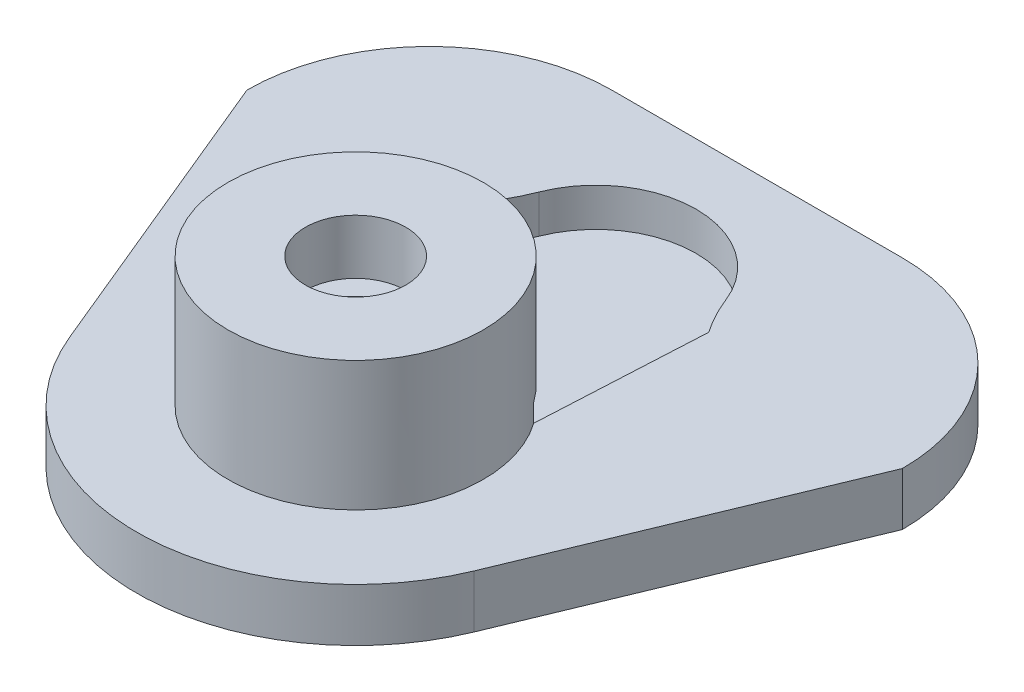
ISO-10303-21;
HEADER;
FILE_DESCRIPTION(('STEP AP214'),'2;1');
FILE_NAME('part.step','',(''),(''),'','','');
FILE_SCHEMA(('AUTOMOTIVE_DESIGN { 1 0 10303 214 1 1 1 1 }'));
ENDSEC;
DATA;
#1=APPLICATION_CONTEXT('core data for automotive mechanical design processes');
#2=APPLICATION_PROTOCOL_DEFINITION('international standard','automotive_design',2000,#1);
#3=PRODUCT_CONTEXT('',#1,'mechanical');
#4=PRODUCT('Part','Part','',(#3));
#5=PRODUCT_RELATED_PRODUCT_CATEGORY('part','',(#4));
#6=PRODUCT_DEFINITION_FORMATION('','',#4);
#7=PRODUCT_DEFINITION_CONTEXT('part definition',#1,'design');
#8=PRODUCT_DEFINITION('design','',#6,#7);
#9=PRODUCT_DEFINITION_SHAPE('','',#8);
#10=(LENGTH_UNIT() NAMED_UNIT(*) SI_UNIT(.MILLI.,.METRE.));
#11=(NAMED_UNIT(*) PLANE_ANGLE_UNIT() SI_UNIT($,.RADIAN.));
#12=(NAMED_UNIT(*) SI_UNIT($,.STERADIAN.) SOLID_ANGLE_UNIT());
#13=UNCERTAINTY_MEASURE_WITH_UNIT(LENGTH_MEASURE(1.E-05),#10,'distance_accuracy_value','');
#14=(GEOMETRIC_REPRESENTATION_CONTEXT(3) GLOBAL_UNCERTAINTY_ASSIGNED_CONTEXT((#13)) GLOBAL_UNIT_ASSIGNED_CONTEXT((#10,
#11,#12)) REPRESENTATION_CONTEXT('',''));
#15=CARTESIAN_POINT('',(0.,0.,0.));
#16=DIRECTION('',(0.,0.,1.));
#17=DIRECTION('',(1.,0.,0.));
#18=AXIS2_PLACEMENT_3D('',#15,#16,#17);
#19=CARTESIAN_POINT('',(0.,-0.000999999999999265,0.));
#20=DIRECTION('',(0.,1.,0.));
#21=DIRECTION('',(0.,0.,1.));
#22=AXIS2_PLACEMENT_3D('',#19,#20,#21);
#23=CYLINDRICAL_SURFACE('',#22,1.55);
#24=CARTESIAN_POINT('',(0.,3.9,0.));
#25=DIRECTION('',(0.,1.,0.));
#26=DIRECTION('',(0.,0.,1.));
#27=AXIS2_PLACEMENT_3D('',#24,#25,#26);
#28=CIRCLE('',#27,1.55);
#29=CARTESIAN_POINT('',(0.,3.9,1.55));
#30=VERTEX_POINT('',#29);
#31=EDGE_CURVE('E219',#30,#30,#28,.F.);
#32=ORIENTED_EDGE('',*,*,#31,.T.);
#33=EDGE_LOOP('',(#32));
#34=FACE_BOUND('',#33,.T.);
#35=CARTESIAN_POINT('',(0.,7.,0.));
#36=DIRECTION('',(0.,1.,0.));
#37=DIRECTION('',(0.,0.,1.));
#38=AXIS2_PLACEMENT_3D('',#35,#36,#37);
#39=CIRCLE('',#38,1.55);
#40=CARTESIAN_POINT('',(0.,7.,1.55));
#41=VERTEX_POINT('',#40);
#42=EDGE_CURVE('E378',#41,#41,#39,.T.);
#43=ORIENTED_EDGE('',*,*,#42,.T.);
#44=EDGE_LOOP('',(#43));
#45=FACE_BOUND('',#44,.T.);
#46=ADVANCED_FACE('F60',(#34,#45),#23,.F.);
#47=CARTESIAN_POINT('',(0.,10.,0.));
#48=DIRECTION('',(0.,-1.,0.));
#49=DIRECTION('',(0.,0.,-1.));
#50=AXIS2_PLACEMENT_3D('',#47,#48,#49);
#51=CYLINDRICAL_SURFACE('',#50,7.);
#52=CARTESIAN_POINT('',(0.,10.,0.));
#53=DIRECTION('',(0.,1.,0.));
#54=DIRECTION('',(0.,0.,1.));
#55=AXIS2_PLACEMENT_3D('',#52,#53,#54);
#56=CIRCLE('',#55,7.);
#57=CARTESIAN_POINT('',(0.,10.,7.));
#58=VERTEX_POINT('',#57);
#59=EDGE_CURVE('E248',#58,#58,#56,.T.);
#60=ORIENTED_EDGE('',*,*,#59,.F.);
#61=EDGE_LOOP('',(#60));
#62=FACE_BOUND('',#61,.T.);
#63=DIRECTION('',(0.,-1.,0.));
#64=VECTOR('',#63,1.);
#65=CARTESIAN_POINT('',(5.71205671884461,10.,-4.04628323782483));
#66=LINE('',#65,#64);
#67=CARTESIAN_POINT('',(5.71205671884461,3.9,-4.04628323782483));
#68=VERTEX_POINT('',#67);
#69=CARTESIAN_POINT('',(5.71205671884461,2.9,-4.04628323782483));
#70=VERTEX_POINT('',#69);
#71=EDGE_CURVE('E243',#68,#70,#66,.T.);
#72=ORIENTED_EDGE('',*,*,#71,.F.);
#73=CARTESIAN_POINT('',(0.,3.9,0.));
#74=DIRECTION('',(0.,1.,0.));
#75=DIRECTION('',(0.,0.,1.));
#76=AXIS2_PLACEMENT_3D('',#73,#74,#75);
#77=CIRCLE('',#76,7.);
#78=CARTESIAN_POINT('',(-5.71205671884461,3.9,-4.04628323782483));
#79=VERTEX_POINT('',#78);
#80=EDGE_CURVE('E186',#68,#79,#77,.T.);
#81=ORIENTED_EDGE('',*,*,#80,.T.);
#82=DIRECTION('',(0.,-1.,0.));
#83=VECTOR('',#82,1.);
#84=CARTESIAN_POINT('',(-5.71205671884461,10.,-4.04628323782483));
#85=LINE('',#84,#83);
#86=CARTESIAN_POINT('',(-5.71205671884461,2.9,-4.04628323782483));
#87=VERTEX_POINT('',#86);
#88=EDGE_CURVE('E240',#87,#79,#85,.F.);
#89=ORIENTED_EDGE('',*,*,#88,.F.);
#90=CARTESIAN_POINT('',(0.,2.9,0.));
#91=DIRECTION('',(0.,1.,0.));
#92=DIRECTION('',(0.,0.,1.));
#93=AXIS2_PLACEMENT_3D('',#90,#91,#92);
#94=CIRCLE('',#93,7.);
#95=EDGE_CURVE('E252',#70,#87,#94,.F.);
#96=ORIENTED_EDGE('',*,*,#95,.F.);
#97=EDGE_LOOP('',(#72,#81,#89,#96));
#98=FACE_BOUND('',#97,.T.);
#99=ADVANCED_FACE('F404',(#62,#98),#51,.T.);
#100=CARTESIAN_POINT('',(0.,2.9,0.));
#101=DIRECTION('',(0.,-1.,0.));
#102=DIRECTION('',(0.,0.,-1.));
#103=AXIS2_PLACEMENT_3D('',#100,#101,#102);
#104=CYLINDRICAL_SURFACE('',#103,12.);
#105=CARTESIAN_POINT('',(0.,0.,0.));
#106=DIRECTION('',(0.,1.,0.));
#107=DIRECTION('',(0.,0.,1.));
#108=AXIS2_PLACEMENT_3D('',#105,#106,#107);
#109=CIRCLE('',#108,12.);
#110=CARTESIAN_POINT('',(-11.0865543901354,0.,4.59220118838109));
#111=VERTEX_POINT('',#110);
#112=CARTESIAN_POINT('',(11.0865543901354,0.,4.59220118838109));
#113=VERTEX_POINT('',#112);
#114=EDGE_CURVE('E256',#111,#113,#109,.T.);
#115=ORIENTED_EDGE('',*,*,#114,.T.);
#116=DIRECTION('',(0.,-1.,0.));
#117=VECTOR('',#116,1.);
#118=CARTESIAN_POINT('',(11.0865543901354,2.9,4.59220118838109));
#119=LINE('',#118,#117);
#120=CARTESIAN_POINT('',(11.0865543901354,2.9,4.59220118838109));
#121=VERTEX_POINT('',#120);
#122=EDGE_CURVE('E337',#121,#113,#119,.T.);
#123=ORIENTED_EDGE('',*,*,#122,.F.);
#124=CARTESIAN_POINT('',(0.,2.9,0.));
#125=DIRECTION('',(0.,1.,0.));
#126=DIRECTION('',(0.,0.,1.));
#127=AXIS2_PLACEMENT_3D('',#124,#125,#126);
#128=CIRCLE('',#127,12.);
#129=CARTESIAN_POINT('',(-11.0865543901354,2.9,4.59220118838109));
#130=VERTEX_POINT('',#129);
#131=EDGE_CURVE('E257',#130,#121,#128,.T.);
#132=ORIENTED_EDGE('',*,*,#131,.F.);
#133=DIRECTION('',(0.,-1.,0.));
#134=VECTOR('',#133,1.);
#135=CARTESIAN_POINT('',(-11.0865543901354,2.9,4.59220118838109));
#136=LINE('',#135,#134);
#137=EDGE_CURVE('E286',#130,#111,#136,.T.);
#138=ORIENTED_EDGE('',*,*,#137,.T.);
#139=EDGE_LOOP('',(#115,#123,#132,#138));
#140=FACE_BOUND('',#139,.T.);
#141=ADVANCED_FACE('F407',(#140),#104,.T.);
#142=CARTESIAN_POINT('',(11.0865543901354,2.9,4.59220118838109));
#143=DIRECTION('',(-0.923879532511286,0.,-0.382683432365091));
#144=DIRECTION('',(-0.382683432365091,0.,0.923879532511287));
#145=AXIS2_PLACEMENT_3D('',#142,#143,#144);
#146=PLANE('',#145);
#147=DIRECTION('',(0.382683432365091,0.,-0.923879532511287));
#148=VECTOR('',#147,1.);
#149=CARTESIAN_POINT('',(11.0865543901354,0.,4.59220118838109));
#150=LINE('',#149,#148);
#151=CARTESIAN_POINT('',(17.9592691519859,0.,-12.));
#152=VERTEX_POINT('',#151);
#153=EDGE_CURVE('E290',#113,#152,#150,.T.);
#154=ORIENTED_EDGE('',*,*,#153,.T.);
#155=DIRECTION('',(0.,-1.,0.));
#156=VECTOR('',#155,1.);
#157=CARTESIAN_POINT('',(17.9592691519859,2.9,-12.));
#158=LINE('',#157,#156);
#159=CARTESIAN_POINT('',(17.9592691519859,2.9,-12.));
#160=VERTEX_POINT('',#159);
#161=EDGE_CURVE('E333',#160,#152,#158,.T.);
#162=ORIENTED_EDGE('',*,*,#161,.F.);
#163=DIRECTION('',(0.382683432365091,0.,-0.923879532511287));
#164=VECTOR('',#163,1.);
#165=CARTESIAN_POINT('',(11.0865543901354,2.9,4.59220118838109));
#166=LINE('',#165,#164);
#167=EDGE_CURVE('E261',#121,#160,#166,.T.);
#168=ORIENTED_EDGE('',*,*,#167,.F.);
#169=ORIENTED_EDGE('',*,*,#122,.T.);
#170=EDGE_LOOP('',(#154,#162,#168,#169));
#171=FACE_BOUND('',#170,.T.);
#172=ADVANCED_FACE('F469',(#171),#146,.F.);
#173=CARTESIAN_POINT('',(17.9592691519859,2.9,0.));
#174=DIRECTION('',(-1.,0.,0.));
#175=DIRECTION('',(0.,0.,1.));
#176=AXIS2_PLACEMENT_3D('',#173,#174,#175);
#177=PLANE('',#176);
#178=DIRECTION('',(0.,0.,-1.));
#179=VECTOR('',#178,1.);
#180=CARTESIAN_POINT('',(17.9592691519859,0.,0.));
#181=LINE('',#180,#179);
#182=CARTESIAN_POINT('',(17.9592691519859,0.,-12.01));
#183=VERTEX_POINT('',#182);
#184=EDGE_CURVE('E293',#152,#183,#181,.T.);
#185=ORIENTED_EDGE('',*,*,#184,.T.);
#186=DIRECTION('',(0.,-1.,0.));
#187=VECTOR('',#186,1.);
#188=CARTESIAN_POINT('',(17.9592691519859,2.9,-12.01));
#189=LINE('',#188,#187);
#190=CARTESIAN_POINT('',(17.9592691519859,2.9,-12.01));
#191=VERTEX_POINT('',#190);
#192=EDGE_CURVE('E329',#191,#183,#189,.T.);
#193=ORIENTED_EDGE('',*,*,#192,.F.);
#194=DIRECTION('',(0.,0.,-1.));
#195=VECTOR('',#194,1.);
#196=CARTESIAN_POINT('',(17.9592691519859,2.9,0.));
#197=LINE('',#196,#195);
#198=EDGE_CURVE('E265',#160,#191,#197,.T.);
#199=ORIENTED_EDGE('',*,*,#198,.F.);
#200=ORIENTED_EDGE('',*,*,#161,.T.);
#201=EDGE_LOOP('',(#185,#193,#199,#200));
#202=FACE_BOUND('',#201,.T.);
#203=ADVANCED_FACE('F465',(#202),#177,.F.);
#204=CARTESIAN_POINT('',(7.96926915198588,2.9,-12.01));
#205=DIRECTION('',(0.,-1.,0.));
#206=DIRECTION('',(0.,0.,-1.));
#207=AXIS2_PLACEMENT_3D('',#204,#205,#206);
#208=CYLINDRICAL_SURFACE('',#207,9.99);
#209=CARTESIAN_POINT('',(7.96926915198588,0.,-12.01));
#210=DIRECTION('',(0.,1.,0.));
#211=DIRECTION('',(0.,0.,1.));
#212=AXIS2_PLACEMENT_3D('',#209,#210,#211);
#213=CIRCLE('',#212,9.99);
#214=CARTESIAN_POINT('',(7.96926915198588,0.,-22.));
#215=VERTEX_POINT('',#214);
#216=EDGE_CURVE('E296',#183,#215,#213,.T.);
#217=ORIENTED_EDGE('',*,*,#216,.T.);
#218=DIRECTION('',(0.,-1.,0.));
#219=VECTOR('',#218,1.);
#220=CARTESIAN_POINT('',(7.96926915198588,2.9,-22.));
#221=LINE('',#220,#219);
#222=CARTESIAN_POINT('',(7.96926915198588,2.9,-22.));
#223=VERTEX_POINT('',#222);
#224=EDGE_CURVE('E325',#223,#215,#221,.T.);
#225=ORIENTED_EDGE('',*,*,#224,.F.);
#226=CARTESIAN_POINT('',(7.96926915198588,2.9,-12.01));
#227=DIRECTION('',(0.,1.,0.));
#228=DIRECTION('',(0.,0.,1.));
#229=AXIS2_PLACEMENT_3D('',#226,#227,#228);
#230=CIRCLE('',#229,9.99);
#231=EDGE_CURVE('E268',#191,#223,#230,.T.);
#232=ORIENTED_EDGE('',*,*,#231,.F.);
#233=ORIENTED_EDGE('',*,*,#192,.T.);
#234=EDGE_LOOP('',(#217,#225,#232,#233));
#235=FACE_BOUND('',#234,.T.);
#236=ADVANCED_FACE('F461',(#235),#208,.T.);
#237=CARTESIAN_POINT('',(0.,2.9,-22.));
#238=DIRECTION('',(0.,0.,1.));
#239=DIRECTION('',(1.,0.,0.));
#240=AXIS2_PLACEMENT_3D('',#237,#238,#239);
#241=PLANE('',#240);
#242=DIRECTION('',(-1.,0.,0.));
#243=VECTOR('',#242,1.);
#244=CARTESIAN_POINT('',(0.,0.,-22.));
#245=LINE('',#244,#243);
#246=CARTESIAN_POINT('',(-7.96926915198588,0.,-22.));
#247=VERTEX_POINT('',#246);
#248=EDGE_CURVE('E299',#215,#247,#245,.T.);
#249=ORIENTED_EDGE('',*,*,#248,.T.);
#250=DIRECTION('',(0.,-1.,0.));
#251=VECTOR('',#250,1.);
#252=CARTESIAN_POINT('',(-7.96926915198588,2.9,-22.));
#253=LINE('',#252,#251);
#254=CARTESIAN_POINT('',(-7.96926915198588,2.9,-22.));
#255=VERTEX_POINT('',#254);
#256=EDGE_CURVE('E322',#255,#247,#253,.T.);
#257=ORIENTED_EDGE('',*,*,#256,.F.);
#258=DIRECTION('',(-1.,0.,0.));
#259=VECTOR('',#258,1.);
#260=CARTESIAN_POINT('',(0.,2.9,-22.));
#261=LINE('',#260,#259);
#262=EDGE_CURVE('E271',#223,#255,#261,.T.);
#263=ORIENTED_EDGE('',*,*,#262,.F.);
#264=ORIENTED_EDGE('',*,*,#224,.T.);
#265=EDGE_LOOP('',(#249,#257,#263,#264));
#266=FACE_BOUND('',#265,.T.);
#267=ADVANCED_FACE('F457',(#266),#241,.F.);
#268=CARTESIAN_POINT('',(-7.96926915198588,2.9,-12.01));
#269=DIRECTION('',(0.,-1.,0.));
#270=DIRECTION('',(0.,0.,-1.));
#271=AXIS2_PLACEMENT_3D('',#268,#269,#270);
#272=CYLINDRICAL_SURFACE('',#271,9.99);
#273=CARTESIAN_POINT('',(-7.96926915198588,0.,-12.01));
#274=DIRECTION('',(0.,1.,0.));
#275=DIRECTION('',(0.,0.,1.));
#276=AXIS2_PLACEMENT_3D('',#273,#274,#275);
#277=CIRCLE('',#276,9.99);
#278=CARTESIAN_POINT('',(-17.9592691519859,0.,-12.01));
#279=VERTEX_POINT('',#278);
#280=EDGE_CURVE('E303',#279,#247,#277,.F.);
#281=ORIENTED_EDGE('',*,*,#280,.F.);
#282=DIRECTION('',(0.,-1.,0.));
#283=VECTOR('',#282,1.);
#284=CARTESIAN_POINT('',(-17.9592691519859,2.9,-12.01));
#285=LINE('',#284,#283);
#286=CARTESIAN_POINT('',(-17.9592691519859,2.9,-12.01));
#287=VERTEX_POINT('',#286);
#288=EDGE_CURVE('E319',#287,#279,#285,.T.);
#289=ORIENTED_EDGE('',*,*,#288,.F.);
#290=CARTESIAN_POINT('',(-7.96926915198588,2.9,-12.01));
#291=DIRECTION('',(0.,1.,0.));
#292=DIRECTION('',(0.,0.,1.));
#293=AXIS2_PLACEMENT_3D('',#290,#291,#292);
#294=CIRCLE('',#293,9.99);
#295=EDGE_CURVE('E274',#287,#255,#294,.F.);
#296=ORIENTED_EDGE('',*,*,#295,.T.);
#297=ORIENTED_EDGE('',*,*,#256,.T.);
#298=EDGE_LOOP('',(#281,#289,#296,#297));
#299=FACE_BOUND('',#298,.T.);
#300=ADVANCED_FACE('F453',(#299),#272,.T.);
#301=CARTESIAN_POINT('',(-17.9592691519859,2.9,0.));
#302=DIRECTION('',(-1.,0.,0.));
#303=DIRECTION('',(0.,0.,1.));
#304=AXIS2_PLACEMENT_3D('',#301,#302,#303);
#305=PLANE('',#304);
#306=DIRECTION('',(0.,0.,-1.));
#307=VECTOR('',#306,1.);
#308=CARTESIAN_POINT('',(-17.9592691519859,0.,0.));
#309=LINE('',#308,#307);
#310=CARTESIAN_POINT('',(-17.9592691519859,0.,-12.));
#311=VERTEX_POINT('',#310);
#312=EDGE_CURVE('E307',#311,#279,#309,.T.);
#313=ORIENTED_EDGE('',*,*,#312,.F.);
#314=DIRECTION('',(0.,-1.,0.));
#315=VECTOR('',#314,1.);
#316=CARTESIAN_POINT('',(-17.9592691519859,2.9,-12.));
#317=LINE('',#316,#315);
#318=CARTESIAN_POINT('',(-17.9592691519859,2.9,-12.));
#319=VERTEX_POINT('',#318);
#320=EDGE_CURVE('E316',#319,#311,#317,.T.);
#321=ORIENTED_EDGE('',*,*,#320,.F.);
#322=DIRECTION('',(0.,0.,-1.));
#323=VECTOR('',#322,1.);
#324=CARTESIAN_POINT('',(-17.9592691519859,2.9,0.));
#325=LINE('',#324,#323);
#326=EDGE_CURVE('E278',#319,#287,#325,.T.);
#327=ORIENTED_EDGE('',*,*,#326,.T.);
#328=ORIENTED_EDGE('',*,*,#288,.T.);
#329=EDGE_LOOP('',(#313,#321,#327,#328));
#330=FACE_BOUND('',#329,.T.);
#331=ADVANCED_FACE('F449',(#330),#305,.T.);
#332=CARTESIAN_POINT('',(-11.0865543901354,2.9,4.59220118838109));
#333=DIRECTION('',(-0.923879532511287,0.,0.382683432365091));
#334=DIRECTION('',(0.382683432365091,0.,0.923879532511287));
#335=AXIS2_PLACEMENT_3D('',#332,#333,#334);
#336=PLANE('',#335);
#337=DIRECTION('',(-0.382683432365091,0.,-0.923879532511287));
#338=VECTOR('',#337,1.);
#339=CARTESIAN_POINT('',(-11.0865543901354,0.,4.59220118838109));
#340=LINE('',#339,#338);
#341=EDGE_CURVE('E262',#111,#311,#340,.T.);
#342=ORIENTED_EDGE('',*,*,#341,.F.);
#343=ORIENTED_EDGE('',*,*,#137,.F.);
#344=DIRECTION('',(-0.382683432365091,0.,-0.923879532511287));
#345=VECTOR('',#344,1.);
#346=CARTESIAN_POINT('',(-11.0865543901354,2.9,4.59220118838109));
#347=LINE('',#346,#345);
#348=EDGE_CURVE('E282',#130,#319,#347,.T.);
#349=ORIENTED_EDGE('',*,*,#348,.T.);
#350=ORIENTED_EDGE('',*,*,#320,.T.);
#351=EDGE_LOOP('',(#342,#343,#349,#350));
#352=FACE_BOUND('',#351,.T.);
#353=ADVANCED_FACE('F443',(#352),#336,.T.);
#354=CARTESIAN_POINT('',(0.,2.9,0.));
#355=DIRECTION('',(0.,1.,0.));
#356=DIRECTION('',(0.,0.,1.));
#357=AXIS2_PLACEMENT_3D('',#354,#355,#356);
#358=PLANE('',#357);
#359=DIRECTION('',(0.0523359562429479,0.,0.998629534754574));
#360=VECTOR('',#359,1.);
#361=CARTESIAN_POINT('',(-5.48493521226275,2.9,0.28745327398607));
#362=LINE('',#361,#360);
#363=CARTESIAN_POINT('',(-6.18967029827432,2.9,-13.1596932308376));
#364=VERTEX_POINT('',#363);
#365=EDGE_CURVE('E195',#364,#87,#362,.T.);
#366=ORIENTED_EDGE('',*,*,#365,.F.);
#367=CARTESIAN_POINT('',(-14.4241946498445,2.9,-18.8335463046665));
#368=DIRECTION('',(0.,1.,0.));
#369=DIRECTION('',(0.,0.,1.));
#370=AXIS2_PLACEMENT_3D('',#367,#368,#369);
#371=CIRCLE('',#370,10.);
#372=CARTESIAN_POINT('',(-5.11826261768675,2.9,-15.1729959344543));
#373=VERTEX_POINT('',#372);
#374=EDGE_CURVE('E344',#364,#373,#371,.T.);
#375=ORIENTED_EDGE('',*,*,#374,.T.);
#376=CARTESIAN_POINT('',(0.,2.9,-13.1596932308376));
#377=DIRECTION('',(0.,1.,0.));
#378=DIRECTION('',(0.,0.,1.));
#379=AXIS2_PLACEMENT_3D('',#376,#377,#378);
#380=CIRCLE('',#379,5.5);
#381=CARTESIAN_POINT('',(5.11826261768674,2.9,-15.1729959344543));
#382=VERTEX_POINT('',#381);
#383=EDGE_CURVE('E363',#382,#373,#380,.T.);
#384=ORIENTED_EDGE('',*,*,#383,.F.);
#385=CARTESIAN_POINT('',(14.4241946498445,2.9,-18.8335463046665));
#386=DIRECTION('',(0.,1.,0.));
#387=DIRECTION('',(0.,0.,1.));
#388=AXIS2_PLACEMENT_3D('',#385,#386,#387);
#389=CIRCLE('',#388,10.);
#390=CARTESIAN_POINT('',(6.18967029827431,2.9,-13.1596932308376));
#391=VERTEX_POINT('',#390);
#392=EDGE_CURVE('E341',#382,#391,#389,.T.);
#393=ORIENTED_EDGE('',*,*,#392,.T.);
#394=DIRECTION('',(0.0523359562429473,0.,-0.998629534754574));
#395=VECTOR('',#394,1.);
#396=CARTESIAN_POINT('',(5.48493521226275,2.9,0.287453273986066));
#397=LINE('',#396,#395);
#398=EDGE_CURVE('E209',#70,#391,#397,.T.);
#399=ORIENTED_EDGE('',*,*,#398,.F.);
#400=ORIENTED_EDGE('',*,*,#95,.T.);
#401=EDGE_LOOP('',(#366,#375,#384,#393,#399,#400));
#402=FACE_BOUND('',#401,.T.);
#403=ORIENTED_EDGE('',*,*,#131,.T.);
#404=ORIENTED_EDGE('',*,*,#167,.T.);
#405=ORIENTED_EDGE('',*,*,#198,.T.);
#406=ORIENTED_EDGE('',*,*,#231,.T.);
#407=ORIENTED_EDGE('',*,*,#262,.T.);
#408=ORIENTED_EDGE('',*,*,#295,.F.);
#409=ORIENTED_EDGE('',*,*,#326,.F.);
#410=ORIENTED_EDGE('',*,*,#348,.F.);
#411=EDGE_LOOP('',(#403,#404,#405,#406,#407,#408,#409,#410));
#412=FACE_BOUND('',#411,.T.);
#413=ADVANCED_FACE('F361',(#402,#412),#358,.T.);
#414=CARTESIAN_POINT('',(0.,0.,0.));
#415=DIRECTION('',(0.,1.,0.));
#416=DIRECTION('',(0.,0.,1.));
#417=AXIS2_PLACEMENT_3D('',#414,#415,#416);
#418=PLANE('',#417);
#419=ORIENTED_EDGE('',*,*,#114,.F.);
#420=ORIENTED_EDGE('',*,*,#341,.T.);
#421=ORIENTED_EDGE('',*,*,#312,.T.);
#422=ORIENTED_EDGE('',*,*,#280,.T.);
#423=ORIENTED_EDGE('',*,*,#248,.F.);
#424=ORIENTED_EDGE('',*,*,#216,.F.);
#425=ORIENTED_EDGE('',*,*,#184,.F.);
#426=ORIENTED_EDGE('',*,*,#153,.F.);
#427=EDGE_LOOP('',(#419,#420,#421,#422,#423,#424,#425,#426));
#428=FACE_BOUND('',#427,.T.);
#429=ADVANCED_FACE('F400',(#428),#418,.F.);
#430=CARTESIAN_POINT('',(0.,10.,0.));
#431=DIRECTION('',(0.,1.,0.));
#432=DIRECTION('',(0.,0.,1.));
#433=AXIS2_PLACEMENT_3D('',#430,#431,#432);
#434=PLANE('',#433);
#435=CARTESIAN_POINT('',(0.,10.,0.));
#436=DIRECTION('',(0.,1.,0.));
#437=DIRECTION('',(0.,0.,1.));
#438=AXIS2_PLACEMENT_3D('',#435,#436,#437);
#439=CIRCLE('',#438,2.75);
#440=CARTESIAN_POINT('',(0.,10.,2.75));
#441=VERTEX_POINT('',#440);
#442=EDGE_CURVE('E373',#441,#441,#439,.T.);
#443=ORIENTED_EDGE('',*,*,#442,.F.);
#444=EDGE_LOOP('',(#443));
#445=FACE_BOUND('',#444,.T.);
#446=ORIENTED_EDGE('',*,*,#59,.T.);
#447=EDGE_LOOP('',(#446));
#448=FACE_BOUND('',#447,.T.);
#449=ADVANCED_FACE('F397',(#445,#448),#434,.T.);
#450=CARTESIAN_POINT('',(5.48493521226275,3.9,0.287453273986066));
#451=DIRECTION('',(-0.998629534754574,0.,-0.0523359562429473));
#452=DIRECTION('',(-0.0523359562429473,0.,0.998629534754574));
#453=AXIS2_PLACEMENT_3D('',#450,#451,#452);
#454=PLANE('',#453);
#455=ORIENTED_EDGE('',*,*,#71,.T.);
#456=ORIENTED_EDGE('',*,*,#398,.T.);
#457=DIRECTION('',(0.,1.,0.));
#458=VECTOR('',#457,1.);
#459=CARTESIAN_POINT('',(6.18967029827431,0.799999999999999,-13.1596932308376));
#460=LINE('',#459,#458);
#461=CARTESIAN_POINT('',(6.18967029827431,0.799999999999999,-13.1596932308376));
#462=VERTEX_POINT('',#461);
#463=EDGE_CURVE('E202',#462,#391,#460,.T.);
#464=ORIENTED_EDGE('',*,*,#463,.F.);
#465=DIRECTION('',(0.0523359562429473,0.,-0.998629534754574));
#466=VECTOR('',#465,1.);
#467=CARTESIAN_POINT('',(5.48493521226275,0.799999999999999,0.287453273986066));
#468=LINE('',#467,#466);
#469=CARTESIAN_POINT('',(5.5,0.799999999999999,0.));
#470=VERTEX_POINT('',#469);
#471=EDGE_CURVE('E191',#470,#462,#468,.T.);
#472=ORIENTED_EDGE('',*,*,#471,.F.);
#473=DIRECTION('',(0.,-1.,0.));
#474=VECTOR('',#473,1.);
#475=CARTESIAN_POINT('',(5.5,3.9,0.));
#476=LINE('',#475,#474);
#477=CARTESIAN_POINT('',(5.5,3.9,0.));
#478=VERTEX_POINT('',#477);
#479=EDGE_CURVE('E174',#478,#470,#476,.T.);
#480=ORIENTED_EDGE('',*,*,#479,.F.);
#481=DIRECTION('',(0.0523359562429473,0.,-0.998629534754574));
#482=VECTOR('',#481,1.);
#483=CARTESIAN_POINT('',(5.48493521226275,3.9,0.287453273986066));
#484=LINE('',#483,#482);
#485=EDGE_CURVE('E229',#478,#68,#484,.T.);
#486=ORIENTED_EDGE('',*,*,#485,.T.);
#487=EDGE_LOOP('',(#455,#456,#464,#472,#480,#486));
#488=FACE_BOUND('',#487,.T.);
#489=ADVANCED_FACE('F199',(#488),#454,.T.);
#490=CARTESIAN_POINT('',(-5.48493521226275,3.9,0.28745327398607));
#491=DIRECTION('',(0.998629534754574,0.,-0.0523359562429479));
#492=DIRECTION('',(-0.0523359562429479,0.,-0.998629534754574));
#493=AXIS2_PLACEMENT_3D('',#490,#491,#492);
#494=PLANE('',#493);
#495=ORIENTED_EDGE('',*,*,#88,.T.);
#496=DIRECTION('',(0.0523359562429479,0.,0.998629534754574));
#497=VECTOR('',#496,1.);
#498=CARTESIAN_POINT('',(-5.48493521226275,3.9,0.28745327398607));
#499=LINE('',#498,#497);
#500=CARTESIAN_POINT('',(-5.5,3.9,0.));
#501=VERTEX_POINT('',#500);
#502=EDGE_CURVE('E232',#79,#501,#499,.T.);
#503=ORIENTED_EDGE('',*,*,#502,.T.);
#504=DIRECTION('',(0.,-1.,0.));
#505=VECTOR('',#504,1.);
#506=CARTESIAN_POINT('',(-5.5,3.9,0.));
#507=LINE('',#506,#505);
#508=CARTESIAN_POINT('',(-5.5,0.799999999999999,0.));
#509=VERTEX_POINT('',#508);
#510=EDGE_CURVE('E187',#501,#509,#507,.T.);
#511=ORIENTED_EDGE('',*,*,#510,.T.);
#512=DIRECTION('',(0.0523359562429479,0.,0.998629534754574));
#513=VECTOR('',#512,1.);
#514=CARTESIAN_POINT('',(-5.48493521226275,0.799999999999999,0.28745327398607));
#515=LINE('',#514,#513);
#516=CARTESIAN_POINT('',(-6.18967029827432,0.799999999999999,-13.1596932308376));
#517=VERTEX_POINT('',#516);
#518=EDGE_CURVE('E193',#517,#509,#515,.T.);
#519=ORIENTED_EDGE('',*,*,#518,.F.);
#520=DIRECTION('',(0.,1.,0.));
#521=VECTOR('',#520,1.);
#522=CARTESIAN_POINT('',(-6.18967029827432,0.799999999999999,-13.1596932308376));
#523=LINE('',#522,#521);
#524=EDGE_CURVE('E215',#517,#364,#523,.T.);
#525=ORIENTED_EDGE('',*,*,#524,.T.);
#526=ORIENTED_EDGE('',*,*,#365,.T.);
#527=EDGE_LOOP('',(#495,#503,#511,#519,#525,#526));
#528=FACE_BOUND('',#527,.T.);
#529=ADVANCED_FACE('F356',(#528),#494,.T.);
#530=CARTESIAN_POINT('',(0.,3.9,0.));
#531=DIRECTION('',(0.,-1.,0.));
#532=DIRECTION('',(0.,0.,-1.));
#533=AXIS2_PLACEMENT_3D('',#530,#531,#532);
#534=CYLINDRICAL_SURFACE('',#533,5.5);
#535=CARTESIAN_POINT('',(0.,0.799999999999999,0.));
#536=DIRECTION('',(0.,1.,0.));
#537=DIRECTION('',(0.,0.,1.));
#538=AXIS2_PLACEMENT_3D('',#535,#536,#537);
#539=CIRCLE('',#538,5.5);
#540=EDGE_CURVE('E179',#470,#509,#539,.T.);
#541=ORIENTED_EDGE('',*,*,#540,.T.);
#542=ORIENTED_EDGE('',*,*,#510,.F.);
#543=CARTESIAN_POINT('',(0.,3.9,0.));
#544=DIRECTION('',(0.,1.,0.));
#545=DIRECTION('',(0.,0.,1.));
#546=AXIS2_PLACEMENT_3D('',#543,#544,#545);
#547=CIRCLE('',#546,5.5);
#548=EDGE_CURVE('E181',#501,#478,#547,.T.);
#549=ORIENTED_EDGE('',*,*,#548,.T.);
#550=ORIENTED_EDGE('',*,*,#479,.T.);
#551=EDGE_LOOP('',(#541,#542,#549,#550));
#552=FACE_BOUND('',#551,.T.);
#553=CARTESIAN_POINT('',(0.,0.4,0.));
#554=DIRECTION('',(0.,1.,0.));
#555=DIRECTION('',(0.,0.,1.));
#556=AXIS2_PLACEMENT_3D('',#553,#554,#555);
#557=CIRCLE('',#556,5.5);
#558=CARTESIAN_POINT('',(0.,0.4,5.5));
#559=VERTEX_POINT('',#558);
#560=EDGE_CURVE('E225',#559,#559,#557,.T.);
#561=ORIENTED_EDGE('',*,*,#560,.F.);
#562=EDGE_LOOP('',(#561));
#563=FACE_BOUND('',#562,.T.);
#564=ADVANCED_FACE('F176',(#552,#563),#534,.F.);
#565=CARTESIAN_POINT('',(0.,3.9,0.));
#566=DIRECTION('',(0.,1.,0.));
#567=DIRECTION('',(0.,0.,1.));
#568=AXIS2_PLACEMENT_3D('',#565,#566,#567);
#569=PLANE('',#568);
#570=ORIENTED_EDGE('',*,*,#31,.F.);
#571=EDGE_LOOP('',(#570));
#572=FACE_BOUND('',#571,.T.);
#573=ORIENTED_EDGE('',*,*,#548,.F.);
#574=ORIENTED_EDGE('',*,*,#502,.F.);
#575=ORIENTED_EDGE('',*,*,#80,.F.);
#576=ORIENTED_EDGE('',*,*,#485,.F.);
#577=EDGE_LOOP('',(#573,#574,#575,#576));
#578=FACE_BOUND('',#577,.T.);
#579=ADVANCED_FACE('F413',(#572,#578),#569,.F.);
#580=CARTESIAN_POINT('',(0.,0.4,0.));
#581=DIRECTION('',(0.,1.,0.));
#582=DIRECTION('',(0.,0.,1.));
#583=AXIS2_PLACEMENT_3D('',#580,#581,#582);
#584=PLANE('',#583);
#585=ORIENTED_EDGE('',*,*,#560,.T.);
#586=EDGE_LOOP('',(#585));
#587=FACE_BOUND('',#586,.T.);
#588=ADVANCED_FACE('F428',(#587),#584,.T.);
#589=CARTESIAN_POINT('',(0.,0.799999999999999,0.));
#590=DIRECTION('',(0.,1.,0.));
#591=DIRECTION('',(0.,0.,1.));
#592=AXIS2_PLACEMENT_3D('',#589,#590,#591);
#593=PLANE('',#592);
#594=ORIENTED_EDGE('',*,*,#471,.T.);
#595=CARTESIAN_POINT('',(14.4241946498445,0.799999999999999,-18.8335463046665));
#596=DIRECTION('',(0.,1.,0.));
#597=DIRECTION('',(0.,0.,1.));
#598=AXIS2_PLACEMENT_3D('',#595,#596,#597);
#599=CIRCLE('',#598,10.);
#600=CARTESIAN_POINT('',(5.11826261768674,0.799999999999999,-15.1729959344543));
#601=VERTEX_POINT('',#600);
#602=EDGE_CURVE('E12',#462,#601,#599,.F.);
#603=ORIENTED_EDGE('',*,*,#602,.T.);
#604=CARTESIAN_POINT('',(0.,0.799999999999999,-13.1596932308376));
#605=DIRECTION('',(0.,1.,0.));
#606=DIRECTION('',(0.,0.,1.));
#607=AXIS2_PLACEMENT_3D('',#604,#605,#606);
#608=CIRCLE('',#607,5.5);
#609=CARTESIAN_POINT('',(-5.11826261768675,0.799999999999999,-15.1729959344543));
#610=VERTEX_POINT('',#609);
#611=EDGE_CURVE('E212',#601,#610,#608,.T.);
#612=ORIENTED_EDGE('',*,*,#611,.T.);
#613=CARTESIAN_POINT('',(-14.4241946498445,0.799999999999999,-18.8335463046665));
#614=DIRECTION('',(0.,1.,0.));
#615=DIRECTION('',(0.,0.,1.));
#616=AXIS2_PLACEMENT_3D('',#613,#614,#615);
#617=CIRCLE('',#616,10.);
#618=EDGE_CURVE('E69',#610,#517,#617,.F.);
#619=ORIENTED_EDGE('',*,*,#618,.T.);
#620=ORIENTED_EDGE('',*,*,#518,.T.);
#621=ORIENTED_EDGE('',*,*,#540,.F.);
#622=EDGE_LOOP('',(#594,#603,#612,#619,#620,#621));
#623=FACE_BOUND('',#622,.T.);
#624=ADVANCED_FACE('F190',(#623),#593,.T.);
#625=CARTESIAN_POINT('',(0.,0.799999999999999,-13.1596932308376));
#626=DIRECTION('',(0.,1.,0.));
#627=DIRECTION('',(0.,0.,1.));
#628=AXIS2_PLACEMENT_3D('',#625,#626,#627);
#629=CYLINDRICAL_SURFACE('',#628,5.5);
#630=ORIENTED_EDGE('',*,*,#383,.T.);
#631=DIRECTION('',(0.,1.,0.));
#632=VECTOR('',#631,1.);
#633=CARTESIAN_POINT('',(-5.11826261768675,0.799999999999999,-15.1729959344543));
#634=LINE('',#633,#632);
#635=EDGE_CURVE('E76',#373,#610,#634,.F.);
#636=ORIENTED_EDGE('',*,*,#635,.T.);
#637=ORIENTED_EDGE('',*,*,#611,.F.);
#638=DIRECTION('',(0.,1.,0.));
#639=VECTOR('',#638,1.);
#640=CARTESIAN_POINT('',(5.11826261768674,0.799999999999999,-15.1729959344543));
#641=LINE('',#640,#639);
#642=EDGE_CURVE('E347',#601,#382,#641,.T.);
#643=ORIENTED_EDGE('',*,*,#642,.T.);
#644=EDGE_LOOP('',(#630,#636,#637,#643));
#645=FACE_BOUND('',#644,.T.);
#646=ADVANCED_FACE('F365',(#645),#629,.F.);
#647=CARTESIAN_POINT('',(-14.4241946498445,0.799999999999999,-18.8335463046665));
#648=DIRECTION('',(0.,1.,0.));
#649=DIRECTION('',(0.,0.,1.));
#650=AXIS2_PLACEMENT_3D('',#647,#648,#649);
#651=CYLINDRICAL_SURFACE('',#650,10.);
#652=ORIENTED_EDGE('',*,*,#618,.F.);
#653=ORIENTED_EDGE('',*,*,#635,.F.);
#654=ORIENTED_EDGE('',*,*,#374,.F.);
#655=ORIENTED_EDGE('',*,*,#524,.F.);
#656=EDGE_LOOP('',(#652,#653,#654,#655));
#657=FACE_BOUND('',#656,.T.);
#658=ADVANCED_FACE('F358',(#657),#651,.T.);
#659=CARTESIAN_POINT('',(14.4241946498445,0.799999999999999,-18.8335463046665));
#660=DIRECTION('',(0.,-1.,0.));
#661=DIRECTION('',(0.,0.,-1.));
#662=AXIS2_PLACEMENT_3D('',#659,#660,#661);
#663=CYLINDRICAL_SURFACE('',#662,10.);
#664=ORIENTED_EDGE('',*,*,#392,.F.);
#665=ORIENTED_EDGE('',*,*,#642,.F.);
#666=ORIENTED_EDGE('',*,*,#602,.F.);
#667=ORIENTED_EDGE('',*,*,#463,.T.);
#668=EDGE_LOOP('',(#664,#665,#666,#667));
#669=FACE_BOUND('',#668,.T.);
#670=ADVANCED_FACE('F62',(#669),#663,.T.);
#671=CARTESIAN_POINT('',(0.,7.,0.));
#672=DIRECTION('',(0.,1.,0.));
#673=DIRECTION('',(0.,0.,1.));
#674=AXIS2_PLACEMENT_3D('',#671,#672,#673);
#675=CYLINDRICAL_SURFACE('',#674,2.75);
#676=CARTESIAN_POINT('',(0.,7.,0.));
#677=DIRECTION('',(0.,1.,0.));
#678=DIRECTION('',(0.,0.,1.));
#679=AXIS2_PLACEMENT_3D('',#676,#677,#678);
#680=CIRCLE('',#679,2.75);
#681=CARTESIAN_POINT('',(0.,7.,2.75));
#682=VERTEX_POINT('',#681);
#683=EDGE_CURVE('E368',#682,#682,#680,.T.);
#684=ORIENTED_EDGE('',*,*,#683,.F.);
#685=EDGE_LOOP('',(#684));
#686=FACE_BOUND('',#685,.T.);
#687=ORIENTED_EDGE('',*,*,#442,.T.);
#688=EDGE_LOOP('',(#687));
#689=FACE_BOUND('',#688,.T.);
#690=ADVANCED_FACE('F388',(#686,#689),#675,.F.);
#691=CARTESIAN_POINT('',(0.,7.,0.));
#692=DIRECTION('',(0.,1.,0.));
#693=DIRECTION('',(0.,0.,1.));
#694=AXIS2_PLACEMENT_3D('',#691,#692,#693);
#695=PLANE('',#694);
#696=ORIENTED_EDGE('',*,*,#42,.F.);
#697=EDGE_LOOP('',(#696));
#698=FACE_BOUND('',#697,.T.);
#699=ORIENTED_EDGE('',*,*,#683,.T.);
#700=EDGE_LOOP('',(#699));
#701=FACE_BOUND('',#700,.T.);
#702=ADVANCED_FACE('F385',(#698,#701),#695,.T.);
#703=CLOSED_SHELL('',(#46,#99,#141,#172,#203,#236,#267,#300,#331,#353,#413,#429,#449,#489,#529,
#564,#579,#588,#624,#646,#658,#670,#690,#702));
#704=MANIFOLD_SOLID_BREP('B2',#703);
#705=ADVANCED_BREP_SHAPE_REPRESENTATION('',(#18,#704),#14);
#706=SHAPE_DEFINITION_REPRESENTATION(#9,#705);
ENDSEC;
END-ISO-10303-21;
